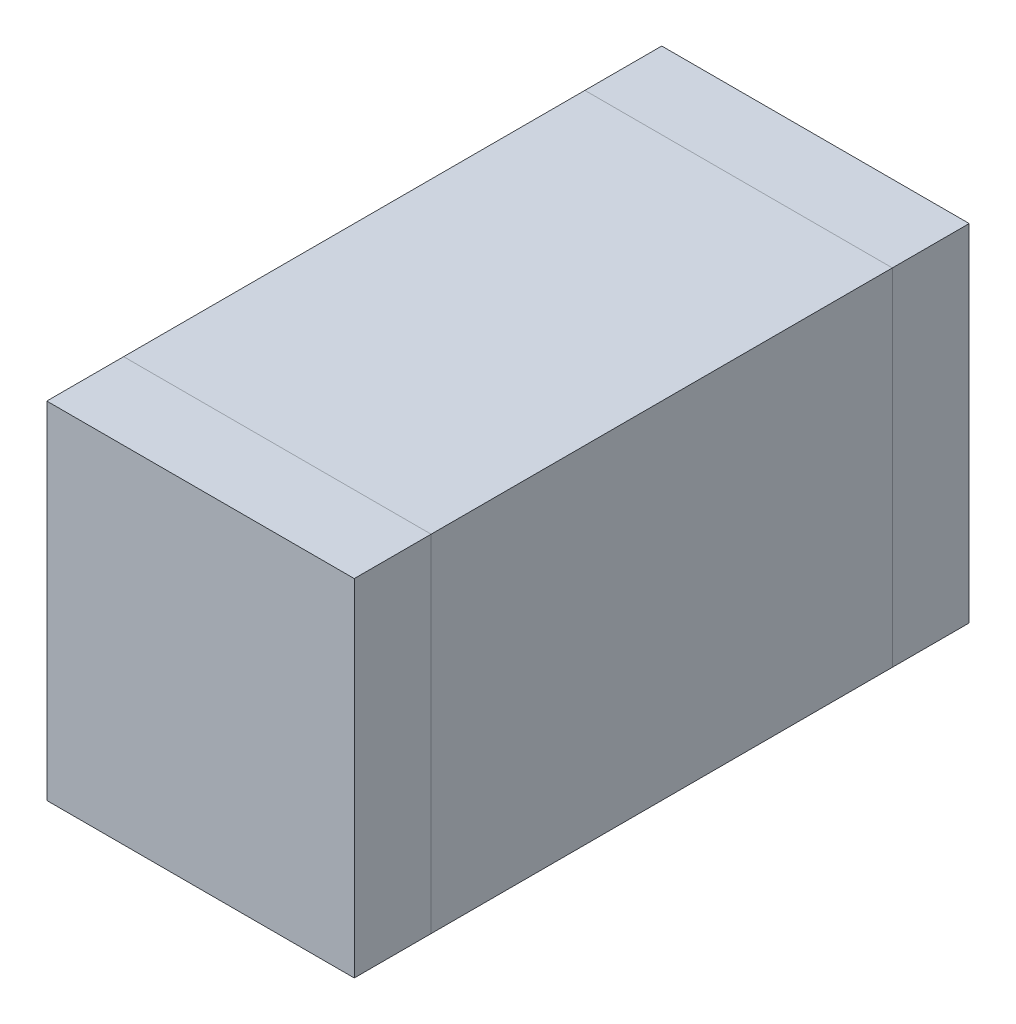
ISO-10303-21;
HEADER;
FILE_DESCRIPTION(('STEP AP214'),'2;1');
FILE_NAME('part.step','',(''),(''),'','','');
FILE_SCHEMA(('AUTOMOTIVE_DESIGN { 1 0 10303 214 1 1 1 1 }'));
ENDSEC;
DATA;
#1=APPLICATION_CONTEXT('core data for automotive mechanical design processes');
#2=APPLICATION_PROTOCOL_DEFINITION('international standard','automotive_design',2000,#1);
#3=PRODUCT_CONTEXT('',#1,'mechanical');
#4=PRODUCT('Part','Part','',(#3));
#5=PRODUCT_RELATED_PRODUCT_CATEGORY('part','',(#4));
#6=PRODUCT_DEFINITION_FORMATION('','',#4);
#7=PRODUCT_DEFINITION_CONTEXT('part definition',#1,'design');
#8=PRODUCT_DEFINITION('design','',#6,#7);
#9=PRODUCT_DEFINITION_SHAPE('','',#8);
#10=(LENGTH_UNIT() NAMED_UNIT(*) SI_UNIT(.MILLI.,.METRE.));
#11=(NAMED_UNIT(*) PLANE_ANGLE_UNIT() SI_UNIT($,.RADIAN.));
#12=(NAMED_UNIT(*) SI_UNIT($,.STERADIAN.) SOLID_ANGLE_UNIT());
#13=UNCERTAINTY_MEASURE_WITH_UNIT(LENGTH_MEASURE(1.E-05),#10,'distance_accuracy_value','');
#14=(GEOMETRIC_REPRESENTATION_CONTEXT(3) GLOBAL_UNCERTAINTY_ASSIGNED_CONTEXT((#13)) GLOBAL_UNIT_ASSIGNED_CONTEXT((#10,
#11,#12)) REPRESENTATION_CONTEXT('',''));
#15=CARTESIAN_POINT('',(0.,0.,0.));
#16=DIRECTION('',(0.,0.,1.));
#17=DIRECTION('',(1.,0.,0.));
#18=AXIS2_PLACEMENT_3D('',#15,#16,#17);
#19=CARTESIAN_POINT('',(0.8,1.8,-1.2));
#20=DIRECTION('',(-1.,0.,0.));
#21=DIRECTION('',(0.,0.,1.));
#22=AXIS2_PLACEMENT_3D('',#19,#20,#21);
#23=PLANE('',#22);
#24=DIRECTION('',(0.,0.,-1.));
#25=VECTOR('',#24,1.);
#26=CARTESIAN_POINT('',(0.8,0.,-1.2));
#27=LINE('',#26,#25);
#28=CARTESIAN_POINT('',(0.8,0.,1.2));
#29=VERTEX_POINT('',#28);
#30=CARTESIAN_POINT('',(0.8,0.,-1.2));
#31=VERTEX_POINT('',#30);
#32=EDGE_CURVE('P0_E11',#29,#31,#27,.T.);
#33=ORIENTED_EDGE('',*,*,#32,.T.);
#34=DIRECTION('',(0.,-1.,0.));
#35=VECTOR('',#34,1.);
#36=CARTESIAN_POINT('',(0.8,1.8,-1.2));
#37=LINE('',#36,#35);
#38=CARTESIAN_POINT('',(0.8,1.8,-1.2));
#39=VERTEX_POINT('',#38);
#40=EDGE_CURVE('P0_E24',#39,#31,#37,.T.);
#41=ORIENTED_EDGE('',*,*,#40,.F.);
#42=DIRECTION('',(0.,0.,-1.));
#43=VECTOR('',#42,1.);
#44=CARTESIAN_POINT('',(0.8,1.8,-1.2));
#45=LINE('',#44,#43);
#46=CARTESIAN_POINT('',(0.8,1.8,1.2));
#47=VERTEX_POINT('',#46);
#48=EDGE_CURVE('P0_E88',#47,#39,#45,.T.);
#49=ORIENTED_EDGE('',*,*,#48,.F.);
#50=DIRECTION('',(0.,-1.,0.));
#51=VECTOR('',#50,1.);
#52=CARTESIAN_POINT('',(0.8,1.8,1.2));
#53=LINE('',#52,#51);
#54=EDGE_CURVE('P0_E77',#47,#29,#53,.T.);
#55=ORIENTED_EDGE('',*,*,#54,.T.);
#56=EDGE_LOOP('',(#33,#41,#49,#55));
#57=FACE_BOUND('',#56,.T.);
#58=ADVANCED_FACE('P0_F17',(#57),#23,.F.);
#59=CARTESIAN_POINT('',(-0.8,1.8,-1.2));
#60=DIRECTION('',(0.,0.,1.));
#61=DIRECTION('',(1.,0.,0.));
#62=AXIS2_PLACEMENT_3D('',#59,#60,#61);
#63=PLANE('',#62);
#64=DIRECTION('',(-1.,0.,0.));
#65=VECTOR('',#64,1.);
#66=CARTESIAN_POINT('',(-0.8,0.,-1.2));
#67=LINE('',#66,#65);
#68=CARTESIAN_POINT('',(-0.8,0.,-1.2));
#69=VERTEX_POINT('',#68);
#70=EDGE_CURVE('P0_E85',#31,#69,#67,.T.);
#71=ORIENTED_EDGE('',*,*,#70,.T.);
#72=DIRECTION('',(0.,-1.,0.));
#73=VECTOR('',#72,1.);
#74=CARTESIAN_POINT('',(-0.8,1.8,-1.2));
#75=LINE('',#74,#73);
#76=CARTESIAN_POINT('',(-0.8,1.8,-1.2));
#77=VERTEX_POINT('',#76);
#78=EDGE_CURVE('P0_E83',#77,#69,#75,.T.);
#79=ORIENTED_EDGE('',*,*,#78,.F.);
#80=DIRECTION('',(-1.,0.,0.));
#81=VECTOR('',#80,1.);
#82=CARTESIAN_POINT('',(-0.8,1.8,-1.2));
#83=LINE('',#82,#81);
#84=EDGE_CURVE('P0_E72',#39,#77,#83,.T.);
#85=ORIENTED_EDGE('',*,*,#84,.F.);
#86=ORIENTED_EDGE('',*,*,#40,.T.);
#87=EDGE_LOOP('',(#71,#79,#85,#86));
#88=FACE_BOUND('',#87,.T.);
#89=ADVANCED_FACE('P0_F90',(#88),#63,.F.);
#90=CARTESIAN_POINT('',(-0.8,1.8,-1.2));
#91=DIRECTION('',(1.,0.,0.));
#92=DIRECTION('',(0.,0.,-1.));
#93=AXIS2_PLACEMENT_3D('',#90,#91,#92);
#94=PLANE('',#93);
#95=DIRECTION('',(0.,0.,1.));
#96=VECTOR('',#95,1.);
#97=CARTESIAN_POINT('',(-0.8,0.,-1.2));
#98=LINE('',#97,#96);
#99=CARTESIAN_POINT('',(-0.8,0.,1.2));
#100=VERTEX_POINT('',#99);
#101=EDGE_CURVE('P0_E60',#69,#100,#98,.T.);
#102=ORIENTED_EDGE('',*,*,#101,.T.);
#103=DIRECTION('',(0.,-1.,0.));
#104=VECTOR('',#103,1.);
#105=CARTESIAN_POINT('',(-0.8,1.8,1.2));
#106=LINE('',#105,#104);
#107=CARTESIAN_POINT('',(-0.8,1.8,1.2));
#108=VERTEX_POINT('',#107);
#109=EDGE_CURVE('P0_E54',#108,#100,#106,.T.);
#110=ORIENTED_EDGE('',*,*,#109,.F.);
#111=DIRECTION('',(0.,0.,1.));
#112=VECTOR('',#111,1.);
#113=CARTESIAN_POINT('',(-0.8,1.8,-1.2));
#114=LINE('',#113,#112);
#115=EDGE_CURVE('P0_E58',#77,#108,#114,.T.);
#116=ORIENTED_EDGE('',*,*,#115,.F.);
#117=ORIENTED_EDGE('',*,*,#78,.T.);
#118=EDGE_LOOP('',(#102,#110,#116,#117));
#119=FACE_BOUND('',#118,.T.);
#120=ADVANCED_FACE('P0_F56',(#119),#94,.F.);
#121=CARTESIAN_POINT('',(-0.8,1.8,1.2));
#122=DIRECTION('',(0.,0.,-1.));
#123=DIRECTION('',(-1.,0.,0.));
#124=AXIS2_PLACEMENT_3D('',#121,#122,#123);
#125=PLANE('',#124);
#126=DIRECTION('',(1.,0.,0.));
#127=VECTOR('',#126,1.);
#128=CARTESIAN_POINT('',(-0.8,0.,1.2));
#129=LINE('',#128,#127);
#130=EDGE_CURVE('P0_E73',#100,#29,#129,.T.);
#131=ORIENTED_EDGE('',*,*,#130,.T.);
#132=ORIENTED_EDGE('',*,*,#54,.F.);
#133=DIRECTION('',(1.,0.,0.));
#134=VECTOR('',#133,1.);
#135=CARTESIAN_POINT('',(-0.8,1.8,1.2));
#136=LINE('',#135,#134);
#137=EDGE_CURVE('P0_E70',#108,#47,#136,.T.);
#138=ORIENTED_EDGE('',*,*,#137,.F.);
#139=ORIENTED_EDGE('',*,*,#109,.T.);
#140=EDGE_LOOP('',(#131,#132,#138,#139));
#141=FACE_BOUND('',#140,.T.);
#142=ADVANCED_FACE('P0_F76',(#141),#125,.F.);
#143=CARTESIAN_POINT('',(0.,1.8,0.));
#144=DIRECTION('',(0.,1.,0.));
#145=DIRECTION('',(0.,0.,1.));
#146=AXIS2_PLACEMENT_3D('',#143,#144,#145);
#147=PLANE('',#146);
#148=ORIENTED_EDGE('',*,*,#48,.T.);
#149=ORIENTED_EDGE('',*,*,#84,.T.);
#150=ORIENTED_EDGE('',*,*,#115,.T.);
#151=ORIENTED_EDGE('',*,*,#137,.T.);
#152=EDGE_LOOP('',(#148,#149,#150,#151));
#153=FACE_BOUND('',#152,.T.);
#154=ADVANCED_FACE('P0_F69',(#153),#147,.T.);
#155=CARTESIAN_POINT('',(0.,0.,0.));
#156=DIRECTION('',(0.,1.,0.));
#157=DIRECTION('',(0.,0.,1.));
#158=AXIS2_PLACEMENT_3D('',#155,#156,#157);
#159=PLANE('',#158);
#160=ORIENTED_EDGE('',*,*,#32,.F.);
#161=ORIENTED_EDGE('',*,*,#130,.F.);
#162=ORIENTED_EDGE('',*,*,#101,.F.);
#163=ORIENTED_EDGE('',*,*,#70,.F.);
#164=EDGE_LOOP('',(#160,#161,#162,#163));
#165=FACE_BOUND('',#164,.T.);
#166=ADVANCED_FACE('P0_F91',(#165),#159,.F.);
#167=CLOSED_SHELL('',(#58,#89,#120,#142,#154,#166));
#168=MANIFOLD_SOLID_BREP('P0_B1',#167);
#169=CARTESIAN_POINT('',(0.,1.8,0.));
#170=DIRECTION('',(0.,1.,0.));
#171=DIRECTION('',(0.,0.,1.));
#172=AXIS2_PLACEMENT_3D('',#169,#170,#171);
#173=PLANE('',#172);
#174=DIRECTION('',(0.,0.,-1.));
#175=VECTOR('',#174,1.);
#176=CARTESIAN_POINT('',(-0.8,1.8,1.2));
#177=LINE('',#176,#175);
#178=CARTESIAN_POINT('',(-0.8,1.8,1.6));
#179=VERTEX_POINT('',#178);
#180=CARTESIAN_POINT('',(-0.8,1.8,1.2));
#181=VERTEX_POINT('',#180);
#182=EDGE_CURVE('P1_E11',#179,#181,#177,.T.);
#183=ORIENTED_EDGE('',*,*,#182,.F.);
#184=DIRECTION('',(-1.,0.,0.));
#185=VECTOR('',#184,1.);
#186=CARTESIAN_POINT('',(-0.8,1.8,1.6));
#187=LINE('',#186,#185);
#188=CARTESIAN_POINT('',(0.8,1.8,1.6));
#189=VERTEX_POINT('',#188);
#190=EDGE_CURVE('P1_E24',#189,#179,#187,.T.);
#191=ORIENTED_EDGE('',*,*,#190,.F.);
#192=DIRECTION('',(0.,0.,1.));
#193=VECTOR('',#192,1.);
#194=CARTESIAN_POINT('',(0.8,1.8,1.2));
#195=LINE('',#194,#193);
#196=CARTESIAN_POINT('',(0.8,1.8,1.2));
#197=VERTEX_POINT('',#196);
#198=EDGE_CURVE('P1_E75',#197,#189,#195,.T.);
#199=ORIENTED_EDGE('',*,*,#198,.F.);
#200=DIRECTION('',(1.,0.,0.));
#201=VECTOR('',#200,1.);
#202=CARTESIAN_POINT('',(-0.8,1.8,1.2));
#203=LINE('',#202,#201);
#204=EDGE_CURVE('P1_E85',#181,#197,#203,.T.);
#205=ORIENTED_EDGE('',*,*,#204,.F.);
#206=EDGE_LOOP('',(#183,#191,#199,#205));
#207=FACE_BOUND('',#206,.T.);
#208=ADVANCED_FACE('P1_F17',(#207),#173,.T.);
#209=CARTESIAN_POINT('',(0.,0.,0.));
#210=DIRECTION('',(0.,1.,0.));
#211=DIRECTION('',(0.,0.,1.));
#212=AXIS2_PLACEMENT_3D('',#209,#210,#211);
#213=PLANE('',#212);
#214=DIRECTION('',(0.,0.,-1.));
#215=VECTOR('',#214,1.);
#216=CARTESIAN_POINT('',(-0.8,0.,1.2));
#217=LINE('',#216,#215);
#218=CARTESIAN_POINT('',(-0.8,0.,1.6));
#219=VERTEX_POINT('',#218);
#220=CARTESIAN_POINT('',(-0.8,0.,1.2));
#221=VERTEX_POINT('',#220);
#222=EDGE_CURVE('P1_E83',#219,#221,#217,.T.);
#223=ORIENTED_EDGE('',*,*,#222,.T.);
#224=DIRECTION('',(1.,0.,0.));
#225=VECTOR('',#224,1.);
#226=CARTESIAN_POINT('',(-0.8,0.,1.2));
#227=LINE('',#226,#225);
#228=CARTESIAN_POINT('',(0.8,0.,1.2));
#229=VERTEX_POINT('',#228);
#230=EDGE_CURVE('P1_E60',#221,#229,#227,.T.);
#231=ORIENTED_EDGE('',*,*,#230,.T.);
#232=DIRECTION('',(0.,0.,1.));
#233=VECTOR('',#232,1.);
#234=CARTESIAN_POINT('',(0.8,0.,1.2));
#235=LINE('',#234,#233);
#236=CARTESIAN_POINT('',(0.8,0.,1.6));
#237=VERTEX_POINT('',#236);
#238=EDGE_CURVE('P1_E54',#229,#237,#235,.T.);
#239=ORIENTED_EDGE('',*,*,#238,.T.);
#240=DIRECTION('',(-1.,0.,0.));
#241=VECTOR('',#240,1.);
#242=CARTESIAN_POINT('',(-0.8,0.,1.6));
#243=LINE('',#242,#241);
#244=EDGE_CURVE('P1_E57',#237,#219,#243,.T.);
#245=ORIENTED_EDGE('',*,*,#244,.T.);
#246=EDGE_LOOP('',(#223,#231,#239,#245));
#247=FACE_BOUND('',#246,.T.);
#248=ADVANCED_FACE('P1_F56',(#247),#213,.F.);
#249=CARTESIAN_POINT('',(-0.8,3.44924225024706,1.2));
#250=DIRECTION('',(0.,0.,-1.));
#251=DIRECTION('',(-1.,0.,0.));
#252=AXIS2_PLACEMENT_3D('',#249,#250,#251);
#253=PLANE('',#252);
#254=DIRECTION('',(0.,-1.,0.));
#255=VECTOR('',#254,1.);
#256=CARTESIAN_POINT('',(-0.8,3.44924225024706,1.2));
#257=LINE('',#256,#255);
#258=EDGE_CURVE('P1_E71',#181,#221,#257,.T.);
#259=ORIENTED_EDGE('',*,*,#258,.F.);
#260=ORIENTED_EDGE('',*,*,#204,.T.);
#261=DIRECTION('',(0.,-1.,0.));
#262=VECTOR('',#261,1.);
#263=CARTESIAN_POINT('',(0.8,3.44924225024706,1.2));
#264=LINE('',#263,#262);
#265=EDGE_CURVE('P1_E76',#197,#229,#264,.T.);
#266=ORIENTED_EDGE('',*,*,#265,.T.);
#267=ORIENTED_EDGE('',*,*,#230,.F.);
#268=EDGE_LOOP('',(#259,#260,#266,#267));
#269=FACE_BOUND('',#268,.T.);
#270=ADVANCED_FACE('P1_F91',(#269),#253,.T.);
#271=CARTESIAN_POINT('',(0.8,3.44924225024706,1.2));
#272=DIRECTION('',(1.,0.,0.));
#273=DIRECTION('',(0.,0.,-1.));
#274=AXIS2_PLACEMENT_3D('',#271,#272,#273);
#275=PLANE('',#274);
#276=ORIENTED_EDGE('',*,*,#265,.F.);
#277=ORIENTED_EDGE('',*,*,#198,.T.);
#278=DIRECTION('',(0.,-1.,0.));
#279=VECTOR('',#278,1.);
#280=CARTESIAN_POINT('',(0.8,3.44924225024706,1.6));
#281=LINE('',#280,#279);
#282=EDGE_CURVE('P1_E69',#189,#237,#281,.T.);
#283=ORIENTED_EDGE('',*,*,#282,.T.);
#284=ORIENTED_EDGE('',*,*,#238,.F.);
#285=EDGE_LOOP('',(#276,#277,#283,#284));
#286=FACE_BOUND('',#285,.T.);
#287=ADVANCED_FACE('P1_F74',(#286),#275,.T.);
#288=CARTESIAN_POINT('',(-0.8,3.44924225024706,1.6));
#289=DIRECTION('',(0.,0.,1.));
#290=DIRECTION('',(1.,0.,0.));
#291=AXIS2_PLACEMENT_3D('',#288,#289,#290);
#292=PLANE('',#291);
#293=ORIENTED_EDGE('',*,*,#282,.F.);
#294=ORIENTED_EDGE('',*,*,#190,.T.);
#295=DIRECTION('',(0.,-1.,0.));
#296=VECTOR('',#295,1.);
#297=CARTESIAN_POINT('',(-0.8,3.44924225024706,1.6));
#298=LINE('',#297,#296);
#299=EDGE_CURVE('P1_E70',#179,#219,#298,.T.);
#300=ORIENTED_EDGE('',*,*,#299,.T.);
#301=ORIENTED_EDGE('',*,*,#244,.F.);
#302=EDGE_LOOP('',(#293,#294,#300,#301));
#303=FACE_BOUND('',#302,.T.);
#304=ADVANCED_FACE('P1_F68',(#303),#292,.T.);
#305=CARTESIAN_POINT('',(-0.8,3.44924225024706,1.2));
#306=DIRECTION('',(-1.,0.,0.));
#307=DIRECTION('',(0.,0.,1.));
#308=AXIS2_PLACEMENT_3D('',#305,#306,#307);
#309=PLANE('',#308);
#310=ORIENTED_EDGE('',*,*,#299,.F.);
#311=ORIENTED_EDGE('',*,*,#182,.T.);
#312=ORIENTED_EDGE('',*,*,#258,.T.);
#313=ORIENTED_EDGE('',*,*,#222,.F.);
#314=EDGE_LOOP('',(#310,#311,#312,#313));
#315=FACE_BOUND('',#314,.T.);
#316=ADVANCED_FACE('P1_F88',(#315),#309,.T.);
#317=CLOSED_SHELL('',(#208,#248,#270,#287,#304,#316));
#318=MANIFOLD_SOLID_BREP('P1_B1',#317);
#319=CARTESIAN_POINT('',(0.,1.8,0.));
#320=DIRECTION('',(0.,1.,0.));
#321=DIRECTION('',(0.,0.,1.));
#322=AXIS2_PLACEMENT_3D('',#319,#320,#321);
#323=PLANE('',#322);
#324=DIRECTION('',(0.,0.,-1.));
#325=VECTOR('',#324,1.);
#326=CARTESIAN_POINT('',(-0.8,1.8,-1.2));
#327=LINE('',#326,#325);
#328=CARTESIAN_POINT('',(-0.8,1.8,-1.2));
#329=VERTEX_POINT('',#328);
#330=CARTESIAN_POINT('',(-0.8,1.8,-1.6));
#331=VERTEX_POINT('',#330);
#332=EDGE_CURVE('P2_E11',#329,#331,#327,.T.);
#333=ORIENTED_EDGE('',*,*,#332,.F.);
#334=DIRECTION('',(-1.,0.,0.));
#335=VECTOR('',#334,1.);
#336=CARTESIAN_POINT('',(-0.8,1.8,-1.2));
#337=LINE('',#336,#335);
#338=CARTESIAN_POINT('',(0.8,1.8,-1.2));
#339=VERTEX_POINT('',#338);
#340=EDGE_CURVE('P2_E24',#339,#329,#337,.T.);
#341=ORIENTED_EDGE('',*,*,#340,.F.);
#342=DIRECTION('',(0.,0.,1.));
#343=VECTOR('',#342,1.);
#344=CARTESIAN_POINT('',(0.8,1.8,-1.2));
#345=LINE('',#344,#343);
#346=CARTESIAN_POINT('',(0.8,1.8,-1.6));
#347=VERTEX_POINT('',#346);
#348=EDGE_CURVE('P2_E75',#347,#339,#345,.T.);
#349=ORIENTED_EDGE('',*,*,#348,.F.);
#350=DIRECTION('',(1.,0.,0.));
#351=VECTOR('',#350,1.);
#352=CARTESIAN_POINT('',(-0.8,1.8,-1.6));
#353=LINE('',#352,#351);
#354=EDGE_CURVE('P2_E85',#331,#347,#353,.T.);
#355=ORIENTED_EDGE('',*,*,#354,.F.);
#356=EDGE_LOOP('',(#333,#341,#349,#355));
#357=FACE_BOUND('',#356,.T.);
#358=ADVANCED_FACE('P2_F17',(#357),#323,.T.);
#359=CARTESIAN_POINT('',(0.,0.,0.));
#360=DIRECTION('',(0.,-1.,0.));
#361=DIRECTION('',(0.,0.,-1.));
#362=AXIS2_PLACEMENT_3D('',#359,#360,#361);
#363=PLANE('',#362);
#364=DIRECTION('',(0.,0.,-1.));
#365=VECTOR('',#364,1.);
#366=CARTESIAN_POINT('',(-0.8,0.,-1.2));
#367=LINE('',#366,#365);
#368=CARTESIAN_POINT('',(-0.8,0.,-1.2));
#369=VERTEX_POINT('',#368);
#370=CARTESIAN_POINT('',(-0.8,0.,-1.6));
#371=VERTEX_POINT('',#370);
#372=EDGE_CURVE('P2_E83',#369,#371,#367,.T.);
#373=ORIENTED_EDGE('',*,*,#372,.T.);
#374=DIRECTION('',(1.,0.,0.));
#375=VECTOR('',#374,1.);
#376=CARTESIAN_POINT('',(-0.8,0.,-1.6));
#377=LINE('',#376,#375);
#378=CARTESIAN_POINT('',(0.8,0.,-1.6));
#379=VERTEX_POINT('',#378);
#380=EDGE_CURVE('P2_E60',#371,#379,#377,.T.);
#381=ORIENTED_EDGE('',*,*,#380,.T.);
#382=DIRECTION('',(0.,0.,1.));
#383=VECTOR('',#382,1.);
#384=CARTESIAN_POINT('',(0.8,0.,-1.2));
#385=LINE('',#384,#383);
#386=CARTESIAN_POINT('',(0.8,0.,-1.2));
#387=VERTEX_POINT('',#386);
#388=EDGE_CURVE('P2_E54',#379,#387,#385,.T.);
#389=ORIENTED_EDGE('',*,*,#388,.T.);
#390=DIRECTION('',(-1.,0.,0.));
#391=VECTOR('',#390,1.);
#392=CARTESIAN_POINT('',(-0.8,0.,-1.2));
#393=LINE('',#392,#391);
#394=EDGE_CURVE('P2_E57',#387,#369,#393,.T.);
#395=ORIENTED_EDGE('',*,*,#394,.T.);
#396=EDGE_LOOP('',(#373,#381,#389,#395));
#397=FACE_BOUND('',#396,.T.);
#398=ADVANCED_FACE('P2_F56',(#397),#363,.T.);
#399=CARTESIAN_POINT('',(-0.8,3.44924225024706,-1.6));
#400=DIRECTION('',(0.,0.,-1.));
#401=DIRECTION('',(-1.,0.,0.));
#402=AXIS2_PLACEMENT_3D('',#399,#400,#401);
#403=PLANE('',#402);
#404=DIRECTION('',(0.,-1.,0.));
#405=VECTOR('',#404,1.);
#406=CARTESIAN_POINT('',(-0.8,3.44924225024706,-1.6));
#407=LINE('',#406,#405);
#408=EDGE_CURVE('P2_E71',#331,#371,#407,.T.);
#409=ORIENTED_EDGE('',*,*,#408,.F.);
#410=ORIENTED_EDGE('',*,*,#354,.T.);
#411=DIRECTION('',(0.,-1.,0.));
#412=VECTOR('',#411,1.);
#413=CARTESIAN_POINT('',(0.8,3.44924225024706,-1.6));
#414=LINE('',#413,#412);
#415=EDGE_CURVE('P2_E76',#347,#379,#414,.T.);
#416=ORIENTED_EDGE('',*,*,#415,.T.);
#417=ORIENTED_EDGE('',*,*,#380,.F.);
#418=EDGE_LOOP('',(#409,#410,#416,#417));
#419=FACE_BOUND('',#418,.T.);
#420=ADVANCED_FACE('P2_F91',(#419),#403,.T.);
#421=CARTESIAN_POINT('',(0.8,3.44924225024706,-1.2));
#422=DIRECTION('',(1.,0.,0.));
#423=DIRECTION('',(0.,0.,-1.));
#424=AXIS2_PLACEMENT_3D('',#421,#422,#423);
#425=PLANE('',#424);
#426=ORIENTED_EDGE('',*,*,#415,.F.);
#427=ORIENTED_EDGE('',*,*,#348,.T.);
#428=DIRECTION('',(0.,-1.,0.));
#429=VECTOR('',#428,1.);
#430=CARTESIAN_POINT('',(0.8,3.44924225024706,-1.2));
#431=LINE('',#430,#429);
#432=EDGE_CURVE('P2_E69',#339,#387,#431,.T.);
#433=ORIENTED_EDGE('',*,*,#432,.T.);
#434=ORIENTED_EDGE('',*,*,#388,.F.);
#435=EDGE_LOOP('',(#426,#427,#433,#434));
#436=FACE_BOUND('',#435,.T.);
#437=ADVANCED_FACE('P2_F74',(#436),#425,.T.);
#438=CARTESIAN_POINT('',(-0.8,3.44924225024706,-1.2));
#439=DIRECTION('',(0.,0.,1.));
#440=DIRECTION('',(1.,0.,0.));
#441=AXIS2_PLACEMENT_3D('',#438,#439,#440);
#442=PLANE('',#441);
#443=ORIENTED_EDGE('',*,*,#432,.F.);
#444=ORIENTED_EDGE('',*,*,#340,.T.);
#445=DIRECTION('',(0.,-1.,0.));
#446=VECTOR('',#445,1.);
#447=CARTESIAN_POINT('',(-0.8,3.44924225024706,-1.2));
#448=LINE('',#447,#446);
#449=EDGE_CURVE('P2_E70',#329,#369,#448,.T.);
#450=ORIENTED_EDGE('',*,*,#449,.T.);
#451=ORIENTED_EDGE('',*,*,#394,.F.);
#452=EDGE_LOOP('',(#443,#444,#450,#451));
#453=FACE_BOUND('',#452,.T.);
#454=ADVANCED_FACE('P2_F68',(#453),#442,.T.);
#455=CARTESIAN_POINT('',(-0.8,3.44924225024706,-1.2));
#456=DIRECTION('',(-1.,0.,0.));
#457=DIRECTION('',(0.,0.,1.));
#458=AXIS2_PLACEMENT_3D('',#455,#456,#457);
#459=PLANE('',#458);
#460=ORIENTED_EDGE('',*,*,#449,.F.);
#461=ORIENTED_EDGE('',*,*,#332,.T.);
#462=ORIENTED_EDGE('',*,*,#408,.T.);
#463=ORIENTED_EDGE('',*,*,#372,.F.);
#464=EDGE_LOOP('',(#460,#461,#462,#463));
#465=FACE_BOUND('',#464,.T.);
#466=ADVANCED_FACE('P2_F88',(#465),#459,.T.);
#467=CLOSED_SHELL('',(#358,#398,#420,#437,#454,#466));
#468=MANIFOLD_SOLID_BREP('P2_B1',#467);
#469=ADVANCED_BREP_SHAPE_REPRESENTATION('',(#18,#168,#318,#468),#14);
#470=SHAPE_DEFINITION_REPRESENTATION(#9,#469);
ENDSEC;
END-ISO-10303-21;
